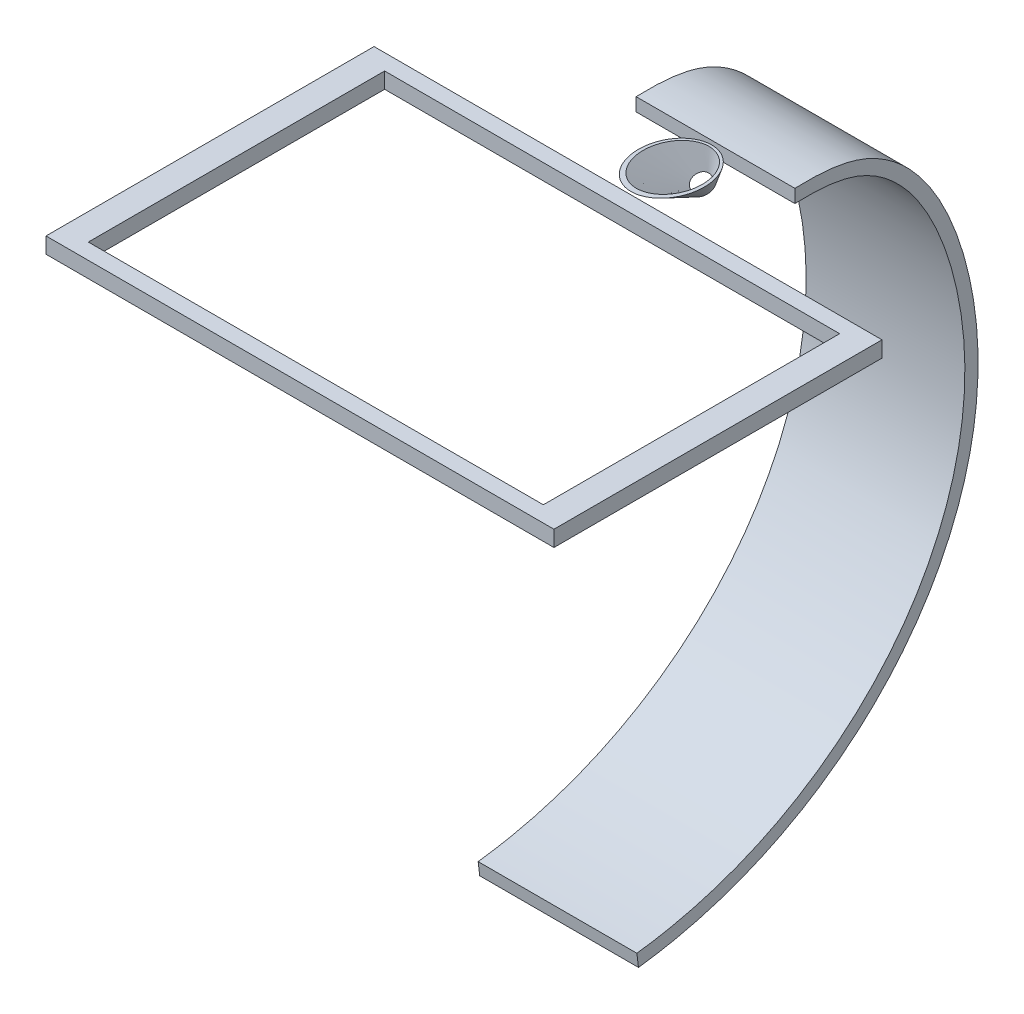
ISO-10303-21;
HEADER;
FILE_DESCRIPTION(('STEP AP214'),'2;1');
FILE_NAME('part.step','',(''),(''),'','','');
FILE_SCHEMA(('AUTOMOTIVE_DESIGN { 1 0 10303 214 1 1 1 1 }'));
ENDSEC;
DATA;
#1=APPLICATION_CONTEXT('core data for automotive mechanical design processes');
#2=APPLICATION_PROTOCOL_DEFINITION('international standard','automotive_design',2000,#1);
#3=PRODUCT_CONTEXT('',#1,'mechanical');
#4=PRODUCT('Part','Part','',(#3));
#5=PRODUCT_RELATED_PRODUCT_CATEGORY('part','',(#4));
#6=PRODUCT_DEFINITION_FORMATION('','',#4);
#7=PRODUCT_DEFINITION_CONTEXT('part definition',#1,'design');
#8=PRODUCT_DEFINITION('design','',#6,#7);
#9=PRODUCT_DEFINITION_SHAPE('','',#8);
#10=(LENGTH_UNIT() NAMED_UNIT(*) SI_UNIT(.MILLI.,.METRE.));
#11=(NAMED_UNIT(*) PLANE_ANGLE_UNIT() SI_UNIT($,.RADIAN.));
#12=(NAMED_UNIT(*) SI_UNIT($,.STERADIAN.) SOLID_ANGLE_UNIT());
#13=UNCERTAINTY_MEASURE_WITH_UNIT(LENGTH_MEASURE(1.E-05),#10,'distance_accuracy_value','');
#14=(GEOMETRIC_REPRESENTATION_CONTEXT(3) GLOBAL_UNCERTAINTY_ASSIGNED_CONTEXT((#13)) GLOBAL_UNIT_ASSIGNED_CONTEXT((#10,
#11,#12)) REPRESENTATION_CONTEXT('',''));
#15=CARTESIAN_POINT('',(0.,0.,0.));
#16=DIRECTION('',(0.,0.,1.));
#17=DIRECTION('',(1.,0.,0.));
#18=AXIS2_PLACEMENT_3D('',#15,#16,#17);
#19=CARTESIAN_POINT('',(-15.,2.48593840485275,-31.3329100844231));
#20=CARTESIAN_POINT('',(-15.,2.44717402761112,-31.696852292471));
#21=CARTESIAN_POINT('',(-15.,2.38824294823583,-32.4142090364533));
#22=CARTESIAN_POINT('',(-15.,2.32356995255598,-33.9523001912764));
#23=CARTESIAN_POINT('',(-15.,2.33909565754535,-35.9852830063143));
#24=CARTESIAN_POINT('',(-15.,2.46772559754929,-38.5828247149783));
#25=CARTESIAN_POINT('',(-15.,2.70402810432445,-41.9316771027311));
#26=CARTESIAN_POINT('',(-15.,2.96101197886056,-45.4199493695626));
#27=CARTESIAN_POINT('',(-15.,3.09622058436183,-49.2514200154989));
#28=CARTESIAN_POINT('',(-15.,3.01594366178968,-53.3846844164878));
#29=CARTESIAN_POINT('',(-15.,2.4306823225353,-57.479184653219));
#30=CARTESIAN_POINT('',(-15.,1.15452736467399,-61.1315197198252));
#31=CARTESIAN_POINT('',(-15.,-0.57924826188276,-64.5235306030383));
#32=CARTESIAN_POINT('',(-15.,-3.49513594927241,-68.3029150162968));
#33=CARTESIAN_POINT('',(-15.,-9.384814256909,-73.3808718963365));
#34=CARTESIAN_POINT('',(-15.,-18.4594607732338,-78.0753352744439));
#35=CARTESIAN_POINT('',(-15.,-30.5482832467864,-81.3838939354672));
#36=CARTESIAN_POINT('',(-15.,-42.3504691068871,-82.5085492739503));
#37=CARTESIAN_POINT('',(-15.,-53.6921835388943,-81.5804122289966));
#38=CARTESIAN_POINT('',(-15.,-64.4180393286312,-78.7417231232255));
#39=CARTESIAN_POINT('',(-15.,-74.3727444837945,-74.1424056992247));
#40=CARTESIAN_POINT('',(-15.,-83.4097673044401,-67.9360374841094));
#41=CARTESIAN_POINT('',(-15.,-91.3886193660676,-60.2758224947925));
#42=CARTESIAN_POINT('',(-15.,-98.172791494605,-51.3132242867854));
#43=CARTESIAN_POINT('',(-15.,-102.718417903562,-42.8825055767114));
#44=CARTESIAN_POINT('',(-15.,-105.62271134688,-35.6365891183889));
#45=CARTESIAN_POINT('',(-15.,-107.418579534928,-29.9653160173496));
#46=CARTESIAN_POINT('',(-15.,-108.812948877112,-24.0945969857553));
#47=CARTESIAN_POINT('',(-15.,-109.469520477501,-20.0129163246088));
#48=CARTESIAN_POINT('',(-15.,-109.721308506705,-17.977331625792));
#49=B_SPLINE_CURVE_WITH_KNOTS('',3,(#19,#20,#21,#22,#23,#24,#25,#26,#27,#28,#29,#30,#31,#32,#33,
#34,#35,#36,#37,#38,#39,#40,#41,#42,#43,#44,#45,#46,#47,#48),.UNSPECIFIED.,.F.,.F.,(4,1,1,1,1,1,
1,1,1,1,1,1,1,1,1,1,1,1,1,1,1,1,1,1,1,1,1,4),(0.,0.0078125,0.015625,0.03125,0.046875,0.0625,
0.0891106513691675,0.104735651369168,0.125,0.15625,0.171875,0.1875,0.21875,0.25,0.3125,0.375,
0.4375,0.5,0.5625,0.625,0.6875,0.75,0.8125,0.875,0.90625,0.9375,0.96875,1.),.UNSPECIFIED.);
#50=DIRECTION('',(1.,0.,0.));
#51=VECTOR('',#50,1.);
#52=SURFACE_OF_LINEAR_EXTRUSION('',#49,#51);
#53=DIRECTION('',(1.,0.,0.));
#54=VECTOR('',#53,1.);
#55=CARTESIAN_POINT('',(-15.,3.03097858422021,-47.531164419357));
#56=LINE('',#55,#54);
#57=CARTESIAN_POINT('',(-15.,3.03097858422021,-47.531164419357));
#58=VERTEX_POINT('',#57);
#59=CARTESIAN_POINT('',(15.,3.03097858422021,-47.531164419357));
#60=VERTEX_POINT('',#59);
#61=EDGE_CURVE('E51',#58,#60,#56,.T.);
#62=ORIENTED_EDGE('',*,*,#61,.T.);
#63=CARTESIAN_POINT('',(15.,2.48593840485275,-31.3329100844231));
#64=CARTESIAN_POINT('',(15.,2.44717402761112,-31.696852292471));
#65=CARTESIAN_POINT('',(15.,2.38824294823583,-32.4142090364533));
#66=CARTESIAN_POINT('',(15.,2.32356995255598,-33.9523001912764));
#67=CARTESIAN_POINT('',(15.,2.33909565754535,-35.9852830063143));
#68=CARTESIAN_POINT('',(15.,2.46772559754929,-38.5828247149783));
#69=CARTESIAN_POINT('',(15.,2.70402810432445,-41.9316771027311));
#70=CARTESIAN_POINT('',(15.,2.96101197886056,-45.4199493695626));
#71=CARTESIAN_POINT('',(15.,3.09622058436183,-49.2514200154989));
#72=CARTESIAN_POINT('',(15.,3.01594366178968,-53.3846844164878));
#73=CARTESIAN_POINT('',(15.,2.4306823225353,-57.479184653219));
#74=CARTESIAN_POINT('',(15.,1.15452736467399,-61.1315197198252));
#75=CARTESIAN_POINT('',(15.,-0.57924826188276,-64.5235306030383));
#76=CARTESIAN_POINT('',(15.,-3.49513594927241,-68.3029150162968));
#77=CARTESIAN_POINT('',(15.,-9.384814256909,-73.3808718963365));
#78=CARTESIAN_POINT('',(15.,-18.4594607732338,-78.0753352744439));
#79=CARTESIAN_POINT('',(15.,-30.5482832467864,-81.3838939354672));
#80=CARTESIAN_POINT('',(15.,-42.3504691068871,-82.5085492739503));
#81=CARTESIAN_POINT('',(15.,-53.6921835388943,-81.5804122289966));
#82=CARTESIAN_POINT('',(15.,-64.4180393286312,-78.7417231232255));
#83=CARTESIAN_POINT('',(15.,-74.3727444837945,-74.1424056992247));
#84=CARTESIAN_POINT('',(15.,-83.4097673044401,-67.9360374841094));
#85=CARTESIAN_POINT('',(15.,-91.3886193660676,-60.2758224947925));
#86=CARTESIAN_POINT('',(15.,-98.172791494605,-51.3132242867854));
#87=CARTESIAN_POINT('',(15.,-102.718417903562,-42.8825055767114));
#88=CARTESIAN_POINT('',(15.,-105.62271134688,-35.6365891183889));
#89=CARTESIAN_POINT('',(15.,-107.418579534928,-29.9653160173496));
#90=CARTESIAN_POINT('',(15.,-108.812948877112,-24.0945969857553));
#91=CARTESIAN_POINT('',(15.,-109.469520477501,-20.0129163246088));
#92=CARTESIAN_POINT('',(15.,-109.721308506705,-17.977331625792));
#93=B_SPLINE_CURVE_WITH_KNOTS('',3,(#63,#64,#65,#66,#67,#68,#69,#70,#71,#72,#73,#74,#75,#76,#77,
#78,#79,#80,#81,#82,#83,#84,#85,#86,#87,#88,#89,#90,#91,#92),.UNSPECIFIED.,.F.,.F.,(4,1,1,1,1,1,
1,1,1,1,1,1,1,1,1,1,1,1,1,1,1,1,1,1,1,1,1,4),(0.,0.0078125,0.015625,0.03125,0.046875,0.0625,
0.0891106513691675,0.104735651369168,0.125,0.15625,0.171875,0.1875,0.21875,0.25,0.3125,0.375,
0.4375,0.5,0.5625,0.625,0.6875,0.75,0.8125,0.875,0.90625,0.9375,0.96875,1.),.UNSPECIFIED.);
#94=CARTESIAN_POINT('',(15.,-109.721308506705,-17.977331625792));
#95=VERTEX_POINT('',#94);
#96=EDGE_CURVE('E92',#60,#95,#93,.T.);
#97=ORIENTED_EDGE('',*,*,#96,.T.);
#98=DIRECTION('',(1.,0.,0.));
#99=VECTOR('',#98,1.);
#100=CARTESIAN_POINT('',(-15.,-109.721308506705,-17.977331625792));
#101=LINE('',#100,#99);
#102=CARTESIAN_POINT('',(-15.,-109.721308506705,-17.977331625792));
#103=VERTEX_POINT('',#102);
#104=EDGE_CURVE('E12',#103,#95,#101,.T.);
#105=ORIENTED_EDGE('',*,*,#104,.F.);
#106=EDGE_CURVE('E64',#58,#103,#49,.T.);
#107=ORIENTED_EDGE('',*,*,#106,.F.);
#108=EDGE_LOOP('',(#62,#97,#105,#107));
#109=FACE_BOUND('',#108,.T.);
#110=ADVANCED_FACE('F47',(#109),#52,.F.);
#111=CARTESIAN_POINT('',(-15.,0.536724715366217,-4.33916029101843));
#112=DIRECTION('',(0.,-0.122757689289503,0.992436672901753));
#113=DIRECTION('',(0.,-0.992436672901754,-0.122757689289503));
#114=AXIS2_PLACEMENT_3D('',#111,#112,#113);
#115=PLANE('',#114);
#116=ORIENTED_EDGE('',*,*,#104,.T.);
#117=DIRECTION('',(0.,-0.992436672901753,-0.122757689289503));
#118=VECTOR('',#117,1.);
#119=CARTESIAN_POINT('',(15.,0.536724715366217,-4.33916029101843));
#120=LINE('',#119,#118);
#121=CARTESIAN_POINT('',(15.,-107.240216824451,-17.6704374025682));
#122=VERTEX_POINT('',#121);
#123=EDGE_CURVE('E107',#122,#95,#120,.T.);
#124=ORIENTED_EDGE('',*,*,#123,.F.);
#125=DIRECTION('',(1.,0.,0.));
#126=VECTOR('',#125,1.);
#127=CARTESIAN_POINT('',(-15.,-107.240216824451,-17.6704374025682));
#128=LINE('',#127,#126);
#129=CARTESIAN_POINT('',(-15.,-107.240216824451,-17.6704374025682));
#130=VERTEX_POINT('',#129);
#131=EDGE_CURVE('E56',#130,#122,#128,.T.);
#132=ORIENTED_EDGE('',*,*,#131,.F.);
#133=DIRECTION('',(0.,-0.992436672901753,-0.122757689289503));
#134=VECTOR('',#133,1.);
#135=CARTESIAN_POINT('',(-15.,0.536724715366217,-4.33916029101843));
#136=LINE('',#135,#134);
#137=EDGE_CURVE('E96',#130,#103,#136,.T.);
#138=ORIENTED_EDGE('',*,*,#137,.T.);
#139=EDGE_LOOP('',(#116,#124,#132,#138));
#140=FACE_BOUND('',#139,.T.);
#141=ADVANCED_FACE('F142',(#140),#115,.T.);
#142=CARTESIAN_POINT('',(-15.,0.,-31.068126687515));
#143=CARTESIAN_POINT('',(-15.,-0.872709577356435,-39.2616247692184));
#144=CARTESIAN_POINT('',(-15.,6.13618904317122,-64.856885852152));
#145=CARTESIAN_POINT('',(-15.,-33.965068364162,-83.703241012515));
#146=CARTESIAN_POINT('',(-15.,-82.4857105427344,-74.4321680291662));
#147=CARTESIAN_POINT('',(-15.,-104.253672305425,-41.8152084803714));
#148=CARTESIAN_POINT('',(-15.,-107.240216824451,-17.6704374025682));
#149=B_SPLINE_CURVE_WITH_KNOTS('',3,(#142,#143,#144,#145,#146,#147,#148),.UNSPECIFIED.,.F.,.F.,
(4,1,1,1,4),(0.,0.161872348422224,0.377929861441229,0.621899942840029,1.),.UNSPECIFIED.);
#150=DIRECTION('',(1.,0.,0.));
#151=VECTOR('',#150,1.);
#152=SURFACE_OF_LINEAR_EXTRUSION('',#149,#151);
#153=ORIENTED_EDGE('',*,*,#131,.T.);
#154=CARTESIAN_POINT('',(15.,0.,-31.068126687515));
#155=CARTESIAN_POINT('',(15.,-0.872709577356435,-39.2616247692184));
#156=CARTESIAN_POINT('',(15.,6.13618904317122,-64.856885852152));
#157=CARTESIAN_POINT('',(15.,-33.965068364162,-83.703241012515));
#158=CARTESIAN_POINT('',(15.,-82.4857105427344,-74.4321680291662));
#159=CARTESIAN_POINT('',(15.,-104.253672305425,-41.8152084803714));
#160=CARTESIAN_POINT('',(15.,-107.240216824451,-17.6704374025682));
#161=B_SPLINE_CURVE_WITH_KNOTS('',3,(#154,#155,#156,#157,#158,#159,#160),.UNSPECIFIED.,.F.,.F.,
(4,1,1,1,4),(0.,0.161872348422224,0.377929861441229,0.621899942840029,1.),.UNSPECIFIED.);
#162=CARTESIAN_POINT('',(15.,0.5295888677019,-47.531164419357));
#163=VERTEX_POINT('',#162);
#164=EDGE_CURVE('E103',#163,#122,#161,.T.);
#165=ORIENTED_EDGE('',*,*,#164,.F.);
#166=DIRECTION('',(1.,0.,0.));
#167=VECTOR('',#166,1.);
#168=CARTESIAN_POINT('',(-15.,0.5295888677019,-47.531164419357));
#169=LINE('',#168,#167);
#170=CARTESIAN_POINT('',(-15.,0.5295888677019,-47.531164419357));
#171=VERTEX_POINT('',#170);
#172=EDGE_CURVE('E95',#171,#163,#169,.T.);
#173=ORIENTED_EDGE('',*,*,#172,.F.);
#174=EDGE_CURVE('E130',#171,#130,#149,.T.);
#175=ORIENTED_EDGE('',*,*,#174,.T.);
#176=EDGE_LOOP('',(#153,#165,#173,#175));
#177=FACE_BOUND('',#176,.T.);
#178=ADVANCED_FACE('F139',(#177),#152,.T.);
#179=CARTESIAN_POINT('',(-15.,-1.31852187948608E-13,-47.531164419357));
#180=DIRECTION('',(0.,0.,1.));
#181=DIRECTION('',(0.,-1.,0.));
#182=AXIS2_PLACEMENT_3D('',#179,#180,#181);
#183=PLANE('',#182);
#184=ORIENTED_EDGE('',*,*,#172,.T.);
#185=DIRECTION('',(0.,-1.,0.));
#186=VECTOR('',#185,1.);
#187=CARTESIAN_POINT('',(15.,-1.31852187948608E-13,-47.531164419357));
#188=LINE('',#187,#186);
#189=EDGE_CURVE('E98',#60,#163,#188,.T.);
#190=ORIENTED_EDGE('',*,*,#189,.F.);
#191=ORIENTED_EDGE('',*,*,#61,.F.);
#192=DIRECTION('',(0.,-1.,0.));
#193=VECTOR('',#192,1.);
#194=CARTESIAN_POINT('',(-15.,-1.31852187948608E-13,-47.531164419357));
#195=LINE('',#194,#193);
#196=EDGE_CURVE('E125',#58,#171,#195,.T.);
#197=ORIENTED_EDGE('',*,*,#196,.T.);
#198=EDGE_LOOP('',(#184,#190,#191,#197));
#199=FACE_BOUND('',#198,.T.);
#200=ADVANCED_FACE('F99',(#199),#183,.T.);
#201=CARTESIAN_POINT('',(-15.,0.,0.));
#202=DIRECTION('',(1.,0.,0.));
#203=DIRECTION('',(0.,0.,-1.));
#204=AXIS2_PLACEMENT_3D('',#201,#202,#203);
#205=PLANE('',#204);
#206=ORIENTED_EDGE('',*,*,#106,.T.);
#207=ORIENTED_EDGE('',*,*,#137,.F.);
#208=ORIENTED_EDGE('',*,*,#174,.F.);
#209=ORIENTED_EDGE('',*,*,#196,.F.);
#210=EDGE_LOOP('',(#206,#207,#208,#209));
#211=FACE_BOUND('',#210,.T.);
#212=ADVANCED_FACE('F146',(#211),#205,.F.);
#213=CARTESIAN_POINT('',(15.,0.,0.));
#214=DIRECTION('',(1.,0.,0.));
#215=DIRECTION('',(0.,0.,-1.));
#216=AXIS2_PLACEMENT_3D('',#213,#214,#215);
#217=PLANE('',#216);
#218=ORIENTED_EDGE('',*,*,#96,.F.);
#219=ORIENTED_EDGE('',*,*,#189,.T.);
#220=ORIENTED_EDGE('',*,*,#164,.T.);
#221=ORIENTED_EDGE('',*,*,#123,.T.);
#222=EDGE_LOOP('',(#218,#219,#220,#221));
#223=FACE_BOUND('',#222,.T.);
#224=ADVANCED_FACE('F106',(#223),#217,.T.);
#225=CLOSED_SHELL('',(#110,#141,#178,#200,#212,#224));
#226=MANIFOLD_SOLID_BREP('B2',#225);
#227=CARTESIAN_POINT('',(0.,-21.0016275925318,-12.1252953439687));
#228=DIRECTION('',(0.,0.866025403784437,0.500000000000003));
#229=DIRECTION('',(0.,-0.500000000000003,0.866025403784437));
#230=AXIS2_PLACEMENT_3D('',#227,#228,#229);
#231=PLANE('',#230);
#232=CARTESIAN_POINT('',(0.,-2.13990956946733,-44.7947492779538));
#233=DIRECTION('',(0.,-0.866025403784437,-0.500000000000003));
#234=DIRECTION('',(0.,0.500000000000003,-0.866025403784437));
#235=AXIS2_PLACEMENT_3D('',#232,#233,#234);
#236=CIRCLE('',#235,1.66486581285724);
#237=CARTESIAN_POINT('',(0.,-1.30747666303871,-46.2365653657804));
#238=VERTEX_POINT('',#237);
#239=EDGE_CURVE('E46',#238,#238,#236,.T.);
#240=ORIENTED_EDGE('',*,*,#239,.F.);
#241=EDGE_LOOP('',(#240));
#242=FACE_BOUND('',#241,.T.);
#243=CARTESIAN_POINT('',(0.,-2.13990956946734,-44.7947492779538));
#244=DIRECTION('',(0.,-0.866025403784437,-0.500000000000003));
#245=DIRECTION('',(0.,0.500000000000003,-0.866025403784437));
#246=AXIS2_PLACEMENT_3D('',#243,#244,#245);
#247=CIRCLE('',#246,2.2481825114649);
#248=CARTESIAN_POINT('',(0.,-1.01581831373488,-46.7417324452263));
#249=VERTEX_POINT('',#248);
#250=EDGE_CURVE('E208',#249,#249,#247,.T.);
#251=ORIENTED_EDGE('',*,*,#250,.T.);
#252=EDGE_LOOP('',(#251));
#253=FACE_BOUND('',#252,.T.);
#254=ADVANCED_FACE('F201',(#242,#253),#231,.F.);
#255=CARTESIAN_POINT('',(0.,-2.13990956946733,-44.7947492779538));
#256=DIRECTION('',(0.,0.866025403784437,0.500000000000003));
#257=DIRECTION('',(0.,-0.500000000000003,0.866025403784437));
#258=AXIS2_PLACEMENT_3D('',#255,#256,#257);
#259=CONICAL_SURFACE('',#258,1.66486581285724,0.541052068118244);
#260=CARTESIAN_POINT('',(0.,3.,-39.4451474016927));
#261=DIRECTION('',(0.,-1.,0.));
#262=DIRECTION('',(0.,0.,1.));
#263=AXIS2_PLACEMENT_3D('',#260,#261,#262);
#264=ELLIPSE('',#263,6.86660524891787,5.57736446625655);
#265=CARTESIAN_POINT('',(0.,3.,-32.5785421527748));
#266=VERTEX_POINT('',#265);
#267=EDGE_CURVE('E212',#266,#266,#264,.F.);
#268=ORIENTED_EDGE('',*,*,#267,.T.);
#269=EDGE_LOOP('',(#268));
#270=FACE_BOUND('',#269,.T.);
#271=ORIENTED_EDGE('',*,*,#239,.T.);
#272=EDGE_LOOP('',(#271));
#273=FACE_BOUND('',#272,.T.);
#274=ADVANCED_FACE('F227',(#270,#273),#259,.F.);
#275=CARTESIAN_POINT('',(0.,-2.13990956946734,-44.7947492779538));
#276=DIRECTION('',(0.,0.866025403784437,0.500000000000003));
#277=DIRECTION('',(0.,-0.500000000000003,0.866025403784437));
#278=AXIS2_PLACEMENT_3D('',#275,#276,#277);
#279=CONICAL_SURFACE('',#278,2.2481825114649,0.541052068118244);
#280=CARTESIAN_POINT('',(0.,3.,-39.1795191487968));
#281=DIRECTION('',(0.,-1.,0.));
#282=DIRECTION('',(0.,0.,1.));
#283=AXIS2_PLACEMENT_3D('',#280,#281,#282);
#284=ELLIPSE('',#283,7.63230966583567,6.19930390383323);
#285=CARTESIAN_POINT('',(0.,3.,-31.5472094829611));
#286=VERTEX_POINT('',#285);
#287=EDGE_CURVE('E204',#286,#286,#284,.F.);
#288=ORIENTED_EDGE('',*,*,#287,.F.);
#289=EDGE_LOOP('',(#288));
#290=FACE_BOUND('',#289,.T.);
#291=ORIENTED_EDGE('',*,*,#250,.F.);
#292=EDGE_LOOP('',(#291));
#293=FACE_BOUND('',#292,.T.);
#294=ADVANCED_FACE('F224',(#290,#293),#279,.T.);
#295=CARTESIAN_POINT('',(0.,3.,-47.0101277137866));
#296=DIRECTION('',(0.,-1.,0.));
#297=DIRECTION('',(0.,0.,-1.));
#298=AXIS2_PLACEMENT_3D('',#295,#296,#297);
#299=PLANE('',#298);
#300=ORIENTED_EDGE('',*,*,#287,.T.);
#301=EDGE_LOOP('',(#300));
#302=FACE_BOUND('',#301,.T.);
#303=ORIENTED_EDGE('',*,*,#267,.F.);
#304=EDGE_LOOP('',(#303));
#305=FACE_BOUND('',#304,.T.);
#306=ADVANCED_FACE('F221',(#302,#305),#299,.F.);
#307=CLOSED_SHELL('',(#254,#274,#294,#306));
#308=MANIFOLD_SOLID_BREP('B6',#307);
#309=CARTESIAN_POINT('',(0.,3.,0.));
#310=DIRECTION('',(0.,-1.,0.));
#311=DIRECTION('',(0.,0.,-1.));
#312=AXIS2_PLACEMENT_3D('',#309,#310,#311);
#313=PLANE('',#312);
#314=DIRECTION('',(0.,0.,-1.));
#315=VECTOR('',#314,1.);
#316=CARTESIAN_POINT('',(48.,3.,31.));
#317=LINE('',#316,#315);
#318=CARTESIAN_POINT('',(48.,3.,31.));
#319=VERTEX_POINT('',#318);
#320=CARTESIAN_POINT('',(48.,3.,-31.));
#321=VERTEX_POINT('',#320);
#322=EDGE_CURVE('E369',#319,#321,#317,.T.);
#323=ORIENTED_EDGE('',*,*,#322,.T.);
#324=DIRECTION('',(-1.,0.,0.));
#325=VECTOR('',#324,1.);
#326=CARTESIAN_POINT('',(-48.,3.,-31.));
#327=LINE('',#326,#325);
#328=CARTESIAN_POINT('',(-48.,3.,-31.));
#329=VERTEX_POINT('',#328);
#330=EDGE_CURVE('E372',#321,#329,#327,.T.);
#331=ORIENTED_EDGE('',*,*,#330,.T.);
#332=DIRECTION('',(0.,0.,1.));
#333=VECTOR('',#332,1.);
#334=CARTESIAN_POINT('',(-48.,3.,31.));
#335=LINE('',#334,#333);
#336=CARTESIAN_POINT('',(-48.,3.,31.));
#337=VERTEX_POINT('',#336);
#338=EDGE_CURVE('E375',#329,#337,#335,.T.);
#339=ORIENTED_EDGE('',*,*,#338,.T.);
#340=DIRECTION('',(1.,0.,0.));
#341=VECTOR('',#340,1.);
#342=CARTESIAN_POINT('',(-48.,3.,31.));
#343=LINE('',#342,#341);
#344=EDGE_CURVE('E377',#337,#319,#343,.T.);
#345=ORIENTED_EDGE('',*,*,#344,.T.);
#346=EDGE_LOOP('',(#323,#331,#339,#345));
#347=FACE_BOUND('',#346,.T.);
#348=DIRECTION('',(0.,0.,-1.));
#349=VECTOR('',#348,1.);
#350=CARTESIAN_POINT('',(43.,3.,28.));
#351=LINE('',#350,#349);
#352=CARTESIAN_POINT('',(43.,3.,28.));
#353=VERTEX_POINT('',#352);
#354=CARTESIAN_POINT('',(43.,3.,-28.));
#355=VERTEX_POINT('',#354);
#356=EDGE_CURVE('E333',#353,#355,#351,.T.);
#357=ORIENTED_EDGE('',*,*,#356,.F.);
#358=DIRECTION('',(1.,0.,0.));
#359=VECTOR('',#358,1.);
#360=CARTESIAN_POINT('',(-43.,3.,28.));
#361=LINE('',#360,#359);
#362=CARTESIAN_POINT('',(-43.,3.,28.));
#363=VERTEX_POINT('',#362);
#364=EDGE_CURVE('E355',#363,#353,#361,.T.);
#365=ORIENTED_EDGE('',*,*,#364,.F.);
#366=DIRECTION('',(0.,0.,1.));
#367=VECTOR('',#366,1.);
#368=CARTESIAN_POINT('',(-43.,3.,28.));
#369=LINE('',#368,#367);
#370=CARTESIAN_POINT('',(-43.,3.,-28.));
#371=VERTEX_POINT('',#370);
#372=EDGE_CURVE('E353',#371,#363,#369,.T.);
#373=ORIENTED_EDGE('',*,*,#372,.F.);
#374=DIRECTION('',(-1.,0.,0.));
#375=VECTOR('',#374,1.);
#376=CARTESIAN_POINT('',(-43.,3.,-28.));
#377=LINE('',#376,#375);
#378=EDGE_CURVE('E341',#355,#371,#377,.T.);
#379=ORIENTED_EDGE('',*,*,#378,.F.);
#380=EDGE_LOOP('',(#357,#365,#373,#379));
#381=FACE_BOUND('',#380,.T.);
#382=ADVANCED_FACE('F268',(#347,#381),#313,.F.);
#383=CARTESIAN_POINT('',(0.,0.,0.));
#384=DIRECTION('',(0.,-1.,0.));
#385=DIRECTION('',(0.,0.,-1.));
#386=AXIS2_PLACEMENT_3D('',#383,#384,#385);
#387=PLANE('',#386);
#388=DIRECTION('',(0.,0.,-1.));
#389=VECTOR('',#388,1.);
#390=CARTESIAN_POINT('',(48.,0.,31.));
#391=LINE('',#390,#389);
#392=CARTESIAN_POINT('',(48.,0.,31.));
#393=VERTEX_POINT('',#392);
#394=CARTESIAN_POINT('',(48.,0.,-31.));
#395=VERTEX_POINT('',#394);
#396=EDGE_CURVE('E349',#393,#395,#391,.T.);
#397=ORIENTED_EDGE('',*,*,#396,.F.);
#398=DIRECTION('',(1.,0.,0.));
#399=VECTOR('',#398,1.);
#400=CARTESIAN_POINT('',(-48.,0.,31.));
#401=LINE('',#400,#399);
#402=CARTESIAN_POINT('',(-48.,0.,31.));
#403=VERTEX_POINT('',#402);
#404=EDGE_CURVE('E373',#403,#393,#401,.T.);
#405=ORIENTED_EDGE('',*,*,#404,.F.);
#406=DIRECTION('',(0.,0.,1.));
#407=VECTOR('',#406,1.);
#408=CARTESIAN_POINT('',(-48.,0.,31.));
#409=LINE('',#408,#407);
#410=CARTESIAN_POINT('',(-48.,0.,-31.));
#411=VERTEX_POINT('',#410);
#412=EDGE_CURVE('E384',#411,#403,#409,.T.);
#413=ORIENTED_EDGE('',*,*,#412,.F.);
#414=DIRECTION('',(-1.,0.,0.));
#415=VECTOR('',#414,1.);
#416=CARTESIAN_POINT('',(-48.,0.,-31.));
#417=LINE('',#416,#415);
#418=EDGE_CURVE('E382',#395,#411,#417,.T.);
#419=ORIENTED_EDGE('',*,*,#418,.F.);
#420=EDGE_LOOP('',(#397,#405,#413,#419));
#421=FACE_BOUND('',#420,.T.);
#422=DIRECTION('',(1.,0.,0.));
#423=VECTOR('',#422,1.);
#424=CARTESIAN_POINT('',(-43.,0.,28.));
#425=LINE('',#424,#423);
#426=CARTESIAN_POINT('',(-43.,0.,28.));
#427=VERTEX_POINT('',#426);
#428=CARTESIAN_POINT('',(43.,0.,28.));
#429=VERTEX_POINT('',#428);
#430=EDGE_CURVE('E342',#427,#429,#425,.T.);
#431=ORIENTED_EDGE('',*,*,#430,.T.);
#432=DIRECTION('',(0.,0.,-1.));
#433=VECTOR('',#432,1.);
#434=CARTESIAN_POINT('',(43.,0.,28.));
#435=LINE('',#434,#433);
#436=CARTESIAN_POINT('',(43.,0.,-28.));
#437=VERTEX_POINT('',#436);
#438=EDGE_CURVE('E291',#429,#437,#435,.T.);
#439=ORIENTED_EDGE('',*,*,#438,.T.);
#440=DIRECTION('',(-1.,0.,0.));
#441=VECTOR('',#440,1.);
#442=CARTESIAN_POINT('',(-43.,0.,-28.));
#443=LINE('',#442,#441);
#444=CARTESIAN_POINT('',(-43.,0.,-28.));
#445=VERTEX_POINT('',#444);
#446=EDGE_CURVE('E348',#437,#445,#443,.T.);
#447=ORIENTED_EDGE('',*,*,#446,.T.);
#448=DIRECTION('',(0.,0.,1.));
#449=VECTOR('',#448,1.);
#450=CARTESIAN_POINT('',(-43.,0.,28.));
#451=LINE('',#450,#449);
#452=EDGE_CURVE('E361',#445,#427,#451,.T.);
#453=ORIENTED_EDGE('',*,*,#452,.T.);
#454=EDGE_LOOP('',(#431,#439,#447,#453));
#455=FACE_BOUND('',#454,.T.);
#456=ADVANCED_FACE('F402',(#421,#455),#387,.T.);
#457=CARTESIAN_POINT('',(48.,3.,31.));
#458=DIRECTION('',(-1.,0.,0.));
#459=DIRECTION('',(0.,0.,1.));
#460=AXIS2_PLACEMENT_3D('',#457,#458,#459);
#461=PLANE('',#460);
#462=ORIENTED_EDGE('',*,*,#396,.T.);
#463=DIRECTION('',(0.,-1.,0.));
#464=VECTOR('',#463,1.);
#465=CARTESIAN_POINT('',(48.,3.,-31.));
#466=LINE('',#465,#464);
#467=EDGE_CURVE('E199',#321,#395,#466,.T.);
#468=ORIENTED_EDGE('',*,*,#467,.F.);
#469=ORIENTED_EDGE('',*,*,#322,.F.);
#470=DIRECTION('',(0.,-1.,0.));
#471=VECTOR('',#470,1.);
#472=CARTESIAN_POINT('',(48.,3.,31.));
#473=LINE('',#472,#471);
#474=EDGE_CURVE('E379',#319,#393,#473,.T.);
#475=ORIENTED_EDGE('',*,*,#474,.T.);
#476=EDGE_LOOP('',(#462,#468,#469,#475));
#477=FACE_BOUND('',#476,.T.);
#478=ADVANCED_FACE('F270',(#477),#461,.F.);
#479=CARTESIAN_POINT('',(-48.,3.,-31.));
#480=DIRECTION('',(0.,0.,1.));
#481=DIRECTION('',(1.,0.,0.));
#482=AXIS2_PLACEMENT_3D('',#479,#480,#481);
#483=PLANE('',#482);
#484=ORIENTED_EDGE('',*,*,#418,.T.);
#485=DIRECTION('',(0.,-1.,0.));
#486=VECTOR('',#485,1.);
#487=CARTESIAN_POINT('',(-48.,3.,-31.));
#488=LINE('',#487,#486);
#489=EDGE_CURVE('E276',#329,#411,#488,.T.);
#490=ORIENTED_EDGE('',*,*,#489,.F.);
#491=ORIENTED_EDGE('',*,*,#330,.F.);
#492=ORIENTED_EDGE('',*,*,#467,.T.);
#493=EDGE_LOOP('',(#484,#490,#491,#492));
#494=FACE_BOUND('',#493,.T.);
#495=ADVANCED_FACE('F412',(#494),#483,.F.);
#496=CARTESIAN_POINT('',(-48.,3.,31.));
#497=DIRECTION('',(1.,0.,0.));
#498=DIRECTION('',(0.,0.,-1.));
#499=AXIS2_PLACEMENT_3D('',#496,#497,#498);
#500=PLANE('',#499);
#501=ORIENTED_EDGE('',*,*,#412,.T.);
#502=DIRECTION('',(0.,-1.,0.));
#503=VECTOR('',#502,1.);
#504=CARTESIAN_POINT('',(-48.,3.,31.));
#505=LINE('',#504,#503);
#506=EDGE_CURVE('E389',#337,#403,#505,.T.);
#507=ORIENTED_EDGE('',*,*,#506,.F.);
#508=ORIENTED_EDGE('',*,*,#338,.F.);
#509=ORIENTED_EDGE('',*,*,#489,.T.);
#510=EDGE_LOOP('',(#501,#507,#508,#509));
#511=FACE_BOUND('',#510,.T.);
#512=ADVANCED_FACE('F396',(#511),#500,.F.);
#513=CARTESIAN_POINT('',(-48.,3.,31.));
#514=DIRECTION('',(0.,0.,-1.));
#515=DIRECTION('',(-1.,0.,0.));
#516=AXIS2_PLACEMENT_3D('',#513,#514,#515);
#517=PLANE('',#516);
#518=ORIENTED_EDGE('',*,*,#404,.T.);
#519=ORIENTED_EDGE('',*,*,#474,.F.);
#520=ORIENTED_EDGE('',*,*,#344,.F.);
#521=ORIENTED_EDGE('',*,*,#506,.T.);
#522=EDGE_LOOP('',(#518,#519,#520,#521));
#523=FACE_BOUND('',#522,.T.);
#524=ADVANCED_FACE('F406',(#523),#517,.F.);
#525=CARTESIAN_POINT('',(43.,3.,28.));
#526=DIRECTION('',(-1.,0.,0.));
#527=DIRECTION('',(0.,0.,1.));
#528=AXIS2_PLACEMENT_3D('',#525,#526,#527);
#529=PLANE('',#528);
#530=ORIENTED_EDGE('',*,*,#438,.F.);
#531=DIRECTION('',(0.,-1.,0.));
#532=VECTOR('',#531,1.);
#533=CARTESIAN_POINT('',(43.,3.,28.));
#534=LINE('',#533,#532);
#535=EDGE_CURVE('E337',#353,#429,#534,.T.);
#536=ORIENTED_EDGE('',*,*,#535,.F.);
#537=ORIENTED_EDGE('',*,*,#356,.T.);
#538=DIRECTION('',(0.,-1.,0.));
#539=VECTOR('',#538,1.);
#540=CARTESIAN_POINT('',(43.,3.,-28.));
#541=LINE('',#540,#539);
#542=EDGE_CURVE('E336',#355,#437,#541,.T.);
#543=ORIENTED_EDGE('',*,*,#542,.T.);
#544=EDGE_LOOP('',(#530,#536,#537,#543));
#545=FACE_BOUND('',#544,.T.);
#546=ADVANCED_FACE('F335',(#545),#529,.T.);
#547=CARTESIAN_POINT('',(-43.,3.,-28.));
#548=DIRECTION('',(0.,0.,1.));
#549=DIRECTION('',(1.,0.,0.));
#550=AXIS2_PLACEMENT_3D('',#547,#548,#549);
#551=PLANE('',#550);
#552=ORIENTED_EDGE('',*,*,#446,.F.);
#553=ORIENTED_EDGE('',*,*,#542,.F.);
#554=ORIENTED_EDGE('',*,*,#378,.T.);
#555=DIRECTION('',(0.,-1.,0.));
#556=VECTOR('',#555,1.);
#557=CARTESIAN_POINT('',(-43.,3.,-28.));
#558=LINE('',#557,#556);
#559=EDGE_CURVE('E350',#371,#445,#558,.T.);
#560=ORIENTED_EDGE('',*,*,#559,.T.);
#561=EDGE_LOOP('',(#552,#553,#554,#560));
#562=FACE_BOUND('',#561,.T.);
#563=ADVANCED_FACE('F345',(#562),#551,.T.);
#564=CARTESIAN_POINT('',(-43.,3.,28.));
#565=DIRECTION('',(1.,0.,0.));
#566=DIRECTION('',(0.,0.,-1.));
#567=AXIS2_PLACEMENT_3D('',#564,#565,#566);
#568=PLANE('',#567);
#569=ORIENTED_EDGE('',*,*,#452,.F.);
#570=ORIENTED_EDGE('',*,*,#559,.F.);
#571=ORIENTED_EDGE('',*,*,#372,.T.);
#572=DIRECTION('',(0.,-1.,0.));
#573=VECTOR('',#572,1.);
#574=CARTESIAN_POINT('',(-43.,3.,28.));
#575=LINE('',#574,#573);
#576=EDGE_CURVE('E283',#363,#427,#575,.T.);
#577=ORIENTED_EDGE('',*,*,#576,.T.);
#578=EDGE_LOOP('',(#569,#570,#571,#577));
#579=FACE_BOUND('',#578,.T.);
#580=ADVANCED_FACE('F435',(#579),#568,.T.);
#581=CARTESIAN_POINT('',(-43.,3.,28.));
#582=DIRECTION('',(0.,0.,-1.));
#583=DIRECTION('',(-1.,0.,0.));
#584=AXIS2_PLACEMENT_3D('',#581,#582,#583);
#585=PLANE('',#584);
#586=ORIENTED_EDGE('',*,*,#430,.F.);
#587=ORIENTED_EDGE('',*,*,#576,.F.);
#588=ORIENTED_EDGE('',*,*,#364,.T.);
#589=ORIENTED_EDGE('',*,*,#535,.T.);
#590=EDGE_LOOP('',(#586,#587,#588,#589));
#591=FACE_BOUND('',#590,.T.);
#592=ADVANCED_FACE('F439',(#591),#585,.T.);
#593=CLOSED_SHELL('',(#382,#456,#478,#495,#512,#524,#546,#563,#580,#592));
#594=MANIFOLD_SOLID_BREP('B41',#593);
#595=ADVANCED_BREP_SHAPE_REPRESENTATION('',(#18,#226,#308,#594),#14);
#596=SHAPE_DEFINITION_REPRESENTATION(#9,#595);
ENDSEC;
END-ISO-10303-21;
